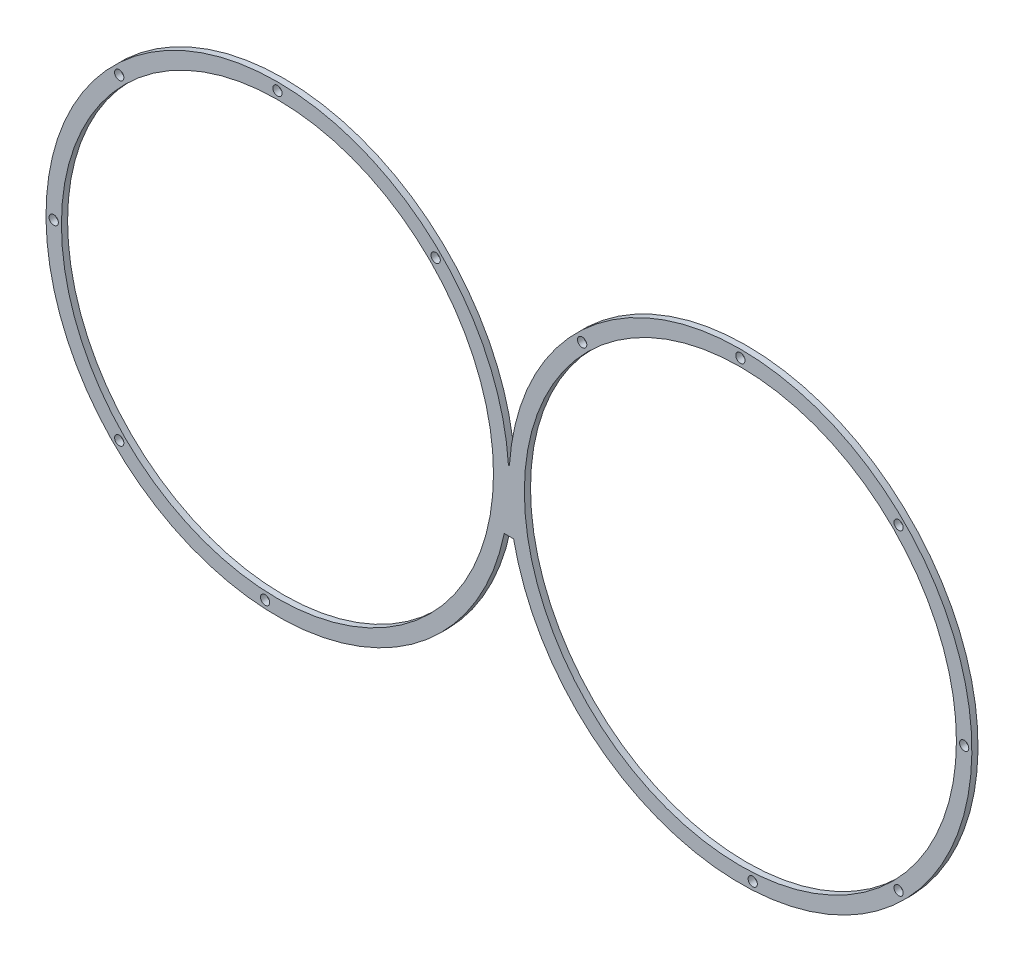
ISO-10303-21;
HEADER;
FILE_DESCRIPTION(('STEP AP214'),'2;1');
FILE_NAME('part.step','',(''),(''),'','','');
FILE_SCHEMA(('AUTOMOTIVE_DESIGN { 1 0 10303 214 1 1 1 1 }'));
ENDSEC;
DATA;
#1=APPLICATION_CONTEXT('core data for automotive mechanical design processes');
#2=APPLICATION_PROTOCOL_DEFINITION('international standard','automotive_design',2000,#1);
#3=PRODUCT_CONTEXT('',#1,'mechanical');
#4=PRODUCT('Part','Part','',(#3));
#5=PRODUCT_RELATED_PRODUCT_CATEGORY('part','',(#4));
#6=PRODUCT_DEFINITION_FORMATION('','',#4);
#7=PRODUCT_DEFINITION_CONTEXT('part definition',#1,'design');
#8=PRODUCT_DEFINITION('design','',#6,#7);
#9=PRODUCT_DEFINITION_SHAPE('','',#8);
#10=(LENGTH_UNIT() NAMED_UNIT(*) SI_UNIT(.MILLI.,.METRE.));
#11=(NAMED_UNIT(*) PLANE_ANGLE_UNIT() SI_UNIT($,.RADIAN.));
#12=(NAMED_UNIT(*) SI_UNIT($,.STERADIAN.) SOLID_ANGLE_UNIT());
#13=UNCERTAINTY_MEASURE_WITH_UNIT(LENGTH_MEASURE(1.E-05),#10,'distance_accuracy_value','');
#14=(GEOMETRIC_REPRESENTATION_CONTEXT(3) GLOBAL_UNCERTAINTY_ASSIGNED_CONTEXT((#13)) GLOBAL_UNIT_ASSIGNED_CONTEXT((#10,
#11,#12)) REPRESENTATION_CONTEXT('',''));
#15=CARTESIAN_POINT('',(0.,0.,0.));
#16=DIRECTION('',(0.,0.,1.));
#17=DIRECTION('',(1.,0.,0.));
#18=AXIS2_PLACEMENT_3D('',#15,#16,#17);
#19=CARTESIAN_POINT('',(0.,10.1713518167665,2.));
#20=DIRECTION('',(0.,1.,0.));
#21=DIRECTION('',(-1.,0.,0.));
#22=AXIS2_PLACEMENT_3D('',#19,#20,#21);
#23=PLANE('',#22);
#24=DIRECTION('',(1.,0.,0.));
#25=VECTOR('',#24,1.);
#26=CARTESIAN_POINT('',(0.,10.1713518167665,0.));
#27=LINE('',#26,#25);
#28=CARTESIAN_POINT('',(-53.2653077165046,10.1713518167664,0.));
#29=VERTEX_POINT('',#28);
#30=CARTESIAN_POINT('',(-50.2346922834954,10.1713518167664,0.));
#31=VERTEX_POINT('',#30);
#32=EDGE_CURVE('E172',#29,#31,#27,.T.);
#33=ORIENTED_EDGE('',*,*,#32,.T.);
#34=DIRECTION('',(0.,0.,-1.));
#35=VECTOR('',#34,1.);
#36=CARTESIAN_POINT('',(-50.2346922834954,10.1713518167664,2.));
#37=LINE('',#36,#35);
#38=CARTESIAN_POINT('',(-50.2346922834954,10.1713518167664,2.));
#39=VERTEX_POINT('',#38);
#40=EDGE_CURVE('E11',#39,#31,#37,.T.);
#41=ORIENTED_EDGE('',*,*,#40,.F.);
#42=DIRECTION('',(1.,0.,0.));
#43=VECTOR('',#42,1.);
#44=CARTESIAN_POINT('',(0.,10.1713518167665,2.));
#45=LINE('',#44,#43);
#46=CARTESIAN_POINT('',(-53.2653077165046,10.1713518167664,2.));
#47=VERTEX_POINT('',#46);
#48=EDGE_CURVE('E100',#47,#39,#45,.T.);
#49=ORIENTED_EDGE('',*,*,#48,.F.);
#50=DIRECTION('',(0.,0.,-1.));
#51=VECTOR('',#50,1.);
#52=CARTESIAN_POINT('',(-53.2653077165046,10.1713518167664,2.));
#53=LINE('',#52,#51);
#54=EDGE_CURVE('E112',#47,#29,#53,.T.);
#55=ORIENTED_EDGE('',*,*,#54,.T.);
#56=EDGE_LOOP('',(#33,#41,#49,#55));
#57=FACE_BOUND('',#56,.T.);
#58=ADVANCED_FACE('F47',(#57),#23,.F.);
#59=CARTESIAN_POINT('',(23.25,25.1713518167665,2.));
#60=DIRECTION('',(0.,0.,-1.));
#61=DIRECTION('',(-1.,0.,0.));
#62=AXIS2_PLACEMENT_3D('',#59,#60,#61);
#63=CYLINDRICAL_SURFACE('',#62,75.);
#64=CARTESIAN_POINT('',(23.25,25.1713518167665,0.));
#65=DIRECTION('',(0.,0.,1.));
#66=DIRECTION('',(1.,0.,0.));
#67=AXIS2_PLACEMENT_3D('',#64,#65,#66);
#68=CIRCLE('',#67,75.);
#69=CARTESIAN_POINT('',(-51.5943996349931,30.0000000000001,0.));
#70=VERTEX_POINT('',#69);
#71=EDGE_CURVE('E105',#31,#70,#68,.T.);
#72=ORIENTED_EDGE('',*,*,#71,.T.);
#73=DIRECTION('',(0.,0.,-1.));
#74=VECTOR('',#73,1.);
#75=CARTESIAN_POINT('',(-51.5943996349931,30.0000000000001,2.));
#76=LINE('',#75,#74);
#77=CARTESIAN_POINT('',(-51.5943996349931,30.0000000000001,2.));
#78=VERTEX_POINT('',#77);
#79=EDGE_CURVE('E57',#78,#70,#76,.T.);
#80=ORIENTED_EDGE('',*,*,#79,.F.);
#81=CARTESIAN_POINT('',(23.25,25.1713518167665,2.));
#82=DIRECTION('',(0.,0.,1.));
#83=DIRECTION('',(1.,0.,0.));
#84=AXIS2_PLACEMENT_3D('',#81,#82,#83);
#85=CIRCLE('',#84,75.);
#86=EDGE_CURVE('E95',#39,#78,#85,.T.);
#87=ORIENTED_EDGE('',*,*,#86,.F.);
#88=ORIENTED_EDGE('',*,*,#40,.T.);
#89=EDGE_LOOP('',(#72,#80,#87,#88));
#90=FACE_BOUND('',#89,.T.);
#91=ADVANCED_FACE('F104',(#90),#63,.T.);
#92=CARTESIAN_POINT('',(-7.69252179049663E-12,30.0000000000133,2.));
#93=DIRECTION('',(2.5641739301644E-13,-1.,0.));
#94=DIRECTION('',(1.,2.5641739301644E-13,0.));
#95=AXIS2_PLACEMENT_3D('',#92,#93,#94);
#96=PLANE('',#95);
#97=DIRECTION('',(-1.,-2.5641739301644E-13,0.));
#98=VECTOR('',#97,1.);
#99=CARTESIAN_POINT('',(-7.69252179049663E-12,30.0000000000133,0.));
#100=LINE('',#99,#98);
#101=CARTESIAN_POINT('',(-51.9056003650069,30.,0.));
#102=VERTEX_POINT('',#101);
#103=EDGE_CURVE('E82',#70,#102,#100,.T.);
#104=ORIENTED_EDGE('',*,*,#103,.T.);
#105=DIRECTION('',(0.,0.,-1.));
#106=VECTOR('',#105,1.);
#107=CARTESIAN_POINT('',(-51.9056003650069,30.,2.));
#108=LINE('',#107,#106);
#109=CARTESIAN_POINT('',(-51.9056003650069,30.,2.));
#110=VERTEX_POINT('',#109);
#111=EDGE_CURVE('E107',#110,#102,#108,.T.);
#112=ORIENTED_EDGE('',*,*,#111,.F.);
#113=DIRECTION('',(-1.,-2.5641739301644E-13,0.));
#114=VECTOR('',#113,1.);
#115=CARTESIAN_POINT('',(-7.69252179049663E-12,30.0000000000133,2.));
#116=LINE('',#115,#114);
#117=EDGE_CURVE('E98',#78,#110,#116,.T.);
#118=ORIENTED_EDGE('',*,*,#117,.F.);
#119=ORIENTED_EDGE('',*,*,#79,.T.);
#120=EDGE_LOOP('',(#104,#112,#118,#119));
#121=FACE_BOUND('',#120,.T.);
#122=ADVANCED_FACE('F108',(#121),#96,.F.);
#123=CARTESIAN_POINT('',(23.25,25.1713518167665,2.));
#124=DIRECTION('',(0.,0.,-1.));
#125=DIRECTION('',(-1.,0.,0.));
#126=AXIS2_PLACEMENT_3D('',#123,#124,#125);
#127=CYLINDRICAL_SURFACE('',#126,70.);
#128=CARTESIAN_POINT('',(23.25,25.1713518167665,2.));
#129=DIRECTION('',(0.,0.,1.));
#130=DIRECTION('',(1.,0.,0.));
#131=AXIS2_PLACEMENT_3D('',#128,#129,#130);
#132=CIRCLE('',#131,70.);
#133=CARTESIAN_POINT('',(93.25,25.1713518167665,2.));
#134=VERTEX_POINT('',#133);
#135=EDGE_CURVE('E192',#134,#134,#132,.T.);
#136=ORIENTED_EDGE('',*,*,#135,.T.);
#137=EDGE_LOOP('',(#136));
#138=FACE_BOUND('',#137,.T.);
#139=CARTESIAN_POINT('',(23.25,25.1713518167665,0.));
#140=DIRECTION('',(0.,0.,1.));
#141=DIRECTION('',(1.,0.,0.));
#142=AXIS2_PLACEMENT_3D('',#139,#140,#141);
#143=CIRCLE('',#142,70.);
#144=CARTESIAN_POINT('',(93.25,25.1713518167665,0.));
#145=VERTEX_POINT('',#144);
#146=EDGE_CURVE('E168',#145,#145,#143,.T.);
#147=ORIENTED_EDGE('',*,*,#146,.F.);
#148=EDGE_LOOP('',(#147));
#149=FACE_BOUND('',#148,.T.);
#150=ADVANCED_FACE('F280',(#138,#149),#127,.F.);
#151=CARTESIAN_POINT('',(-126.75,25.1713518167665,2.));
#152=DIRECTION('',(0.,0.,-1.));
#153=DIRECTION('',(-1.,0.,0.));
#154=AXIS2_PLACEMENT_3D('',#151,#152,#153);
#155=CYLINDRICAL_SURFACE('',#154,70.);
#156=CARTESIAN_POINT('',(-126.75,25.1713518167665,2.));
#157=DIRECTION('',(0.,0.,1.));
#158=DIRECTION('',(1.,0.,0.));
#159=AXIS2_PLACEMENT_3D('',#156,#157,#158);
#160=CIRCLE('',#159,70.);
#161=CARTESIAN_POINT('',(-56.75,25.1713518167665,2.));
#162=VERTEX_POINT('',#161);
#163=EDGE_CURVE('E195',#162,#162,#160,.T.);
#164=ORIENTED_EDGE('',*,*,#163,.T.);
#165=EDGE_LOOP('',(#164));
#166=FACE_BOUND('',#165,.T.);
#167=CARTESIAN_POINT('',(-126.75,25.1713518167665,0.));
#168=DIRECTION('',(0.,0.,1.));
#169=DIRECTION('',(1.,0.,0.));
#170=AXIS2_PLACEMENT_3D('',#167,#168,#169);
#171=CIRCLE('',#170,70.);
#172=CARTESIAN_POINT('',(-56.75,25.1713518167665,0.));
#173=VERTEX_POINT('',#172);
#174=EDGE_CURVE('E164',#173,#173,#171,.T.);
#175=ORIENTED_EDGE('',*,*,#174,.F.);
#176=EDGE_LOOP('',(#175));
#177=FACE_BOUND('',#176,.T.);
#178=ADVANCED_FACE('F283',(#166,#177),#155,.F.);
#179=CARTESIAN_POINT('',(27.25,-47.2182192553155,2.));
#180=DIRECTION('',(0.,0.,-1.));
#181=DIRECTION('',(-1.,0.,0.));
#182=AXIS2_PLACEMENT_3D('',#179,#180,#181);
#183=CYLINDRICAL_SURFACE('',#182,1.5);
#184=CARTESIAN_POINT('',(27.25,-47.2182192553155,2.));
#185=DIRECTION('',(0.,0.,1.));
#186=DIRECTION('',(1.,0.,0.));
#187=AXIS2_PLACEMENT_3D('',#184,#185,#186);
#188=CIRCLE('',#187,1.5);
#189=CARTESIAN_POINT('',(28.75,-47.2182192553155,2.));
#190=VERTEX_POINT('',#189);
#191=EDGE_CURVE('E201',#190,#190,#188,.T.);
#192=ORIENTED_EDGE('',*,*,#191,.T.);
#193=EDGE_LOOP('',(#192));
#194=FACE_BOUND('',#193,.T.);
#195=CARTESIAN_POINT('',(27.25,-47.2182192553155,0.));
#196=DIRECTION('',(0.,0.,1.));
#197=DIRECTION('',(1.,0.,0.));
#198=AXIS2_PLACEMENT_3D('',#195,#196,#197);
#199=CIRCLE('',#198,1.5);
#200=CARTESIAN_POINT('',(28.75,-47.2182192553155,0.));
#201=VERTEX_POINT('',#200);
#202=EDGE_CURVE('E160',#201,#201,#199,.T.);
#203=ORIENTED_EDGE('',*,*,#202,.F.);
#204=EDGE_LOOP('',(#203));
#205=FACE_BOUND('',#204,.T.);
#206=ADVANCED_FACE('F304',(#194,#205),#183,.F.);
#207=CARTESIAN_POINT('',(74.5152416360244,-26.0938898192585,2.));
#208=DIRECTION('',(0.,0.,-1.));
#209=DIRECTION('',(-1.,0.,0.));
#210=AXIS2_PLACEMENT_3D('',#207,#208,#209);
#211=CYLINDRICAL_SURFACE('',#210,1.5);
#212=CARTESIAN_POINT('',(74.5152416360244,-26.0938898192585,2.));
#213=DIRECTION('',(0.,0.,1.));
#214=DIRECTION('',(1.,0.,0.));
#215=AXIS2_PLACEMENT_3D('',#212,#213,#214);
#216=CIRCLE('',#215,1.5);
#217=CARTESIAN_POINT('',(76.0152416360244,-26.0938898192585,2.));
#218=VERTEX_POINT('',#217);
#219=EDGE_CURVE('E205',#218,#218,#216,.T.);
#220=ORIENTED_EDGE('',*,*,#219,.T.);
#221=EDGE_LOOP('',(#220));
#222=FACE_BOUND('',#221,.T.);
#223=CARTESIAN_POINT('',(74.5152416360244,-26.0938898192585,0.));
#224=DIRECTION('',(0.,0.,1.));
#225=DIRECTION('',(1.,0.,0.));
#226=AXIS2_PLACEMENT_3D('',#223,#224,#225);
#227=CIRCLE('',#226,1.5);
#228=CARTESIAN_POINT('',(76.0152416360244,-26.0938898192585,0.));
#229=VERTEX_POINT('',#228);
#230=EDGE_CURVE('E156',#229,#229,#227,.T.);
#231=ORIENTED_EDGE('',*,*,#230,.F.);
#232=EDGE_LOOP('',(#231));
#233=FACE_BOUND('',#232,.T.);
#234=ADVANCED_FACE('F308',(#222,#233),#211,.F.);
#235=CARTESIAN_POINT('',(95.75,25.1713518167665,2.));
#236=DIRECTION('',(0.,0.,-1.));
#237=DIRECTION('',(-1.,0.,0.));
#238=AXIS2_PLACEMENT_3D('',#235,#236,#237);
#239=CYLINDRICAL_SURFACE('',#238,1.5);
#240=CARTESIAN_POINT('',(95.75,25.1713518167665,2.));
#241=DIRECTION('',(0.,0.,1.));
#242=DIRECTION('',(1.,0.,0.));
#243=AXIS2_PLACEMENT_3D('',#240,#241,#242);
#244=CIRCLE('',#243,1.5);
#245=CARTESIAN_POINT('',(97.25,25.1713518167665,2.));
#246=VERTEX_POINT('',#245);
#247=EDGE_CURVE('E209',#246,#246,#244,.T.);
#248=ORIENTED_EDGE('',*,*,#247,.T.);
#249=EDGE_LOOP('',(#248));
#250=FACE_BOUND('',#249,.T.);
#251=CARTESIAN_POINT('',(95.75,25.1713518167665,0.));
#252=DIRECTION('',(0.,0.,1.));
#253=DIRECTION('',(1.,0.,0.));
#254=AXIS2_PLACEMENT_3D('',#251,#252,#253);
#255=CIRCLE('',#254,1.5);
#256=CARTESIAN_POINT('',(97.25,25.1713518167665,0.));
#257=VERTEX_POINT('',#256);
#258=EDGE_CURVE('E152',#257,#257,#255,.T.);
#259=ORIENTED_EDGE('',*,*,#258,.F.);
#260=EDGE_LOOP('',(#259));
#261=FACE_BOUND('',#260,.T.);
#262=ADVANCED_FACE('F312',(#250,#261),#239,.F.);
#263=CARTESIAN_POINT('',(74.5152416360248,76.4365934527911,2.));
#264=DIRECTION('',(0.,0.,-1.));
#265=DIRECTION('',(-1.,0.,0.));
#266=AXIS2_PLACEMENT_3D('',#263,#264,#265);
#267=CYLINDRICAL_SURFACE('',#266,1.5);
#268=CARTESIAN_POINT('',(74.5152416360248,76.4365934527911,2.));
#269=DIRECTION('',(0.,0.,1.));
#270=DIRECTION('',(1.,0.,0.));
#271=AXIS2_PLACEMENT_3D('',#268,#269,#270);
#272=CIRCLE('',#271,1.5);
#273=CARTESIAN_POINT('',(76.0152416360248,76.4365934527911,2.));
#274=VERTEX_POINT('',#273);
#275=EDGE_CURVE('E213',#274,#274,#272,.T.);
#276=ORIENTED_EDGE('',*,*,#275,.T.);
#277=EDGE_LOOP('',(#276));
#278=FACE_BOUND('',#277,.T.);
#279=CARTESIAN_POINT('',(74.5152416360248,76.4365934527911,0.));
#280=DIRECTION('',(0.,0.,1.));
#281=DIRECTION('',(1.,0.,0.));
#282=AXIS2_PLACEMENT_3D('',#279,#280,#281);
#283=CIRCLE('',#282,1.5);
#284=CARTESIAN_POINT('',(76.0152416360248,76.4365934527911,0.));
#285=VERTEX_POINT('',#284);
#286=EDGE_CURVE('E148',#285,#285,#283,.T.);
#287=ORIENTED_EDGE('',*,*,#286,.F.);
#288=EDGE_LOOP('',(#287));
#289=FACE_BOUND('',#288,.T.);
#290=ADVANCED_FACE('F316',(#278,#289),#267,.F.);
#291=CARTESIAN_POINT('',(23.25,97.6713518167665,2.));
#292=DIRECTION('',(0.,0.,-1.));
#293=DIRECTION('',(-1.,0.,0.));
#294=AXIS2_PLACEMENT_3D('',#291,#292,#293);
#295=CYLINDRICAL_SURFACE('',#294,1.5);
#296=CARTESIAN_POINT('',(23.25,97.6713518167665,2.));
#297=DIRECTION('',(0.,0.,1.));
#298=DIRECTION('',(1.,0.,0.));
#299=AXIS2_PLACEMENT_3D('',#296,#297,#298);
#300=CIRCLE('',#299,1.5);
#301=CARTESIAN_POINT('',(24.75,97.6713518167665,2.));
#302=VERTEX_POINT('',#301);
#303=EDGE_CURVE('E217',#302,#302,#300,.T.);
#304=ORIENTED_EDGE('',*,*,#303,.T.);
#305=EDGE_LOOP('',(#304));
#306=FACE_BOUND('',#305,.T.);
#307=CARTESIAN_POINT('',(23.25,97.6713518167665,0.));
#308=DIRECTION('',(0.,0.,1.));
#309=DIRECTION('',(1.,0.,0.));
#310=AXIS2_PLACEMENT_3D('',#307,#308,#309);
#311=CIRCLE('',#310,1.5);
#312=CARTESIAN_POINT('',(24.75,97.6713518167665,0.));
#313=VERTEX_POINT('',#312);
#314=EDGE_CURVE('E144',#313,#313,#311,.T.);
#315=ORIENTED_EDGE('',*,*,#314,.F.);
#316=EDGE_LOOP('',(#315));
#317=FACE_BOUND('',#316,.T.);
#318=ADVANCED_FACE('F320',(#306,#317),#295,.F.);
#319=CARTESIAN_POINT('',(-28.0152416360244,76.4365934527915,2.));
#320=DIRECTION('',(0.,0.,-1.));
#321=DIRECTION('',(-1.,0.,0.));
#322=AXIS2_PLACEMENT_3D('',#319,#320,#321);
#323=CYLINDRICAL_SURFACE('',#322,1.5);
#324=CARTESIAN_POINT('',(-28.0152416360244,76.4365934527915,2.));
#325=DIRECTION('',(0.,0.,1.));
#326=DIRECTION('',(1.,0.,0.));
#327=AXIS2_PLACEMENT_3D('',#324,#325,#326);
#328=CIRCLE('',#327,1.5);
#329=CARTESIAN_POINT('',(-26.5152416360244,76.4365934527915,2.));
#330=VERTEX_POINT('',#329);
#331=EDGE_CURVE('E221',#330,#330,#328,.T.);
#332=ORIENTED_EDGE('',*,*,#331,.T.);
#333=EDGE_LOOP('',(#332));
#334=FACE_BOUND('',#333,.T.);
#335=CARTESIAN_POINT('',(-28.0152416360244,76.4365934527915,0.));
#336=DIRECTION('',(0.,0.,1.));
#337=DIRECTION('',(1.,0.,0.));
#338=AXIS2_PLACEMENT_3D('',#335,#336,#337);
#339=CIRCLE('',#338,1.5);
#340=CARTESIAN_POINT('',(-26.5152416360244,76.4365934527915,0.));
#341=VERTEX_POINT('',#340);
#342=EDGE_CURVE('E140',#341,#341,#339,.T.);
#343=ORIENTED_EDGE('',*,*,#342,.F.);
#344=EDGE_LOOP('',(#343));
#345=FACE_BOUND('',#344,.T.);
#346=ADVANCED_FACE('F324',(#334,#345),#323,.F.);
#347=CARTESIAN_POINT('',(-75.4847583639756,76.4365934527915,2.));
#348=DIRECTION('',(0.,0.,-1.));
#349=DIRECTION('',(-1.,0.,0.));
#350=AXIS2_PLACEMENT_3D('',#347,#348,#349);
#351=CYLINDRICAL_SURFACE('',#350,1.5);
#352=CARTESIAN_POINT('',(-75.4847583639756,76.4365934527915,2.));
#353=DIRECTION('',(0.,0.,1.));
#354=DIRECTION('',(1.,0.,0.));
#355=AXIS2_PLACEMENT_3D('',#352,#353,#354);
#356=CIRCLE('',#355,1.5);
#357=CARTESIAN_POINT('',(-73.9847583639756,76.4365934527915,2.));
#358=VERTEX_POINT('',#357);
#359=EDGE_CURVE('E225',#358,#358,#356,.T.);
#360=ORIENTED_EDGE('',*,*,#359,.T.);
#361=EDGE_LOOP('',(#360));
#362=FACE_BOUND('',#361,.T.);
#363=CARTESIAN_POINT('',(-75.4847583639756,76.4365934527915,0.));
#364=DIRECTION('',(0.,0.,1.));
#365=DIRECTION('',(1.,0.,0.));
#366=AXIS2_PLACEMENT_3D('',#363,#364,#365);
#367=CIRCLE('',#366,1.5);
#368=CARTESIAN_POINT('',(-73.9847583639756,76.4365934527915,0.));
#369=VERTEX_POINT('',#368);
#370=EDGE_CURVE('E136',#369,#369,#367,.T.);
#371=ORIENTED_EDGE('',*,*,#370,.F.);
#372=EDGE_LOOP('',(#371));
#373=FACE_BOUND('',#372,.T.);
#374=ADVANCED_FACE('F328',(#362,#373),#351,.F.);
#375=CARTESIAN_POINT('',(-126.75,97.6713518167665,2.));
#376=DIRECTION('',(0.,0.,-1.));
#377=DIRECTION('',(-1.,0.,0.));
#378=AXIS2_PLACEMENT_3D('',#375,#376,#377);
#379=CYLINDRICAL_SURFACE('',#378,1.5);
#380=CARTESIAN_POINT('',(-126.75,97.6713518167665,2.));
#381=DIRECTION('',(0.,0.,1.));
#382=DIRECTION('',(1.,0.,0.));
#383=AXIS2_PLACEMENT_3D('',#380,#381,#382);
#384=CIRCLE('',#383,1.5);
#385=CARTESIAN_POINT('',(-125.25,97.6713518167665,2.));
#386=VERTEX_POINT('',#385);
#387=EDGE_CURVE('E229',#386,#386,#384,.T.);
#388=ORIENTED_EDGE('',*,*,#387,.T.);
#389=EDGE_LOOP('',(#388));
#390=FACE_BOUND('',#389,.T.);
#391=CARTESIAN_POINT('',(-126.75,97.6713518167665,0.));
#392=DIRECTION('',(0.,0.,1.));
#393=DIRECTION('',(1.,0.,0.));
#394=AXIS2_PLACEMENT_3D('',#391,#392,#393);
#395=CIRCLE('',#394,1.5);
#396=CARTESIAN_POINT('',(-125.25,97.6713518167665,0.));
#397=VERTEX_POINT('',#396);
#398=EDGE_CURVE('E132',#397,#397,#395,.T.);
#399=ORIENTED_EDGE('',*,*,#398,.F.);
#400=EDGE_LOOP('',(#399));
#401=FACE_BOUND('',#400,.T.);
#402=ADVANCED_FACE('F332',(#390,#401),#379,.F.);
#403=CARTESIAN_POINT('',(-178.015241636025,76.4365934527911,2.));
#404=DIRECTION('',(0.,0.,-1.));
#405=DIRECTION('',(-1.,0.,0.));
#406=AXIS2_PLACEMENT_3D('',#403,#404,#405);
#407=CYLINDRICAL_SURFACE('',#406,1.5);
#408=CARTESIAN_POINT('',(-178.015241636025,76.4365934527911,2.));
#409=DIRECTION('',(0.,0.,1.));
#410=DIRECTION('',(1.,0.,0.));
#411=AXIS2_PLACEMENT_3D('',#408,#409,#410);
#412=CIRCLE('',#411,1.5);
#413=CARTESIAN_POINT('',(-176.515241636025,76.4365934527911,2.));
#414=VERTEX_POINT('',#413);
#415=EDGE_CURVE('E233',#414,#414,#412,.T.);
#416=ORIENTED_EDGE('',*,*,#415,.T.);
#417=EDGE_LOOP('',(#416));
#418=FACE_BOUND('',#417,.T.);
#419=CARTESIAN_POINT('',(-178.015241636025,76.4365934527911,0.));
#420=DIRECTION('',(0.,0.,1.));
#421=DIRECTION('',(1.,0.,0.));
#422=AXIS2_PLACEMENT_3D('',#419,#420,#421);
#423=CIRCLE('',#422,1.5);
#424=CARTESIAN_POINT('',(-176.515241636025,76.4365934527911,0.));
#425=VERTEX_POINT('',#424);
#426=EDGE_CURVE('E128',#425,#425,#423,.T.);
#427=ORIENTED_EDGE('',*,*,#426,.F.);
#428=EDGE_LOOP('',(#427));
#429=FACE_BOUND('',#428,.T.);
#430=ADVANCED_FACE('F336',(#418,#429),#407,.F.);
#431=CARTESIAN_POINT('',(-130.75,-47.2182192553155,2.));
#432=DIRECTION('',(0.,0.,-1.));
#433=DIRECTION('',(-1.,0.,0.));
#434=AXIS2_PLACEMENT_3D('',#431,#432,#433);
#435=CYLINDRICAL_SURFACE('',#434,1.5);
#436=CARTESIAN_POINT('',(-130.75,-47.2182192553155,2.));
#437=DIRECTION('',(0.,0.,1.));
#438=DIRECTION('',(1.,0.,0.));
#439=AXIS2_PLACEMENT_3D('',#436,#437,#438);
#440=CIRCLE('',#439,1.5);
#441=CARTESIAN_POINT('',(-129.25,-47.2182192553155,2.));
#442=VERTEX_POINT('',#441);
#443=EDGE_CURVE('E237',#442,#442,#440,.T.);
#444=ORIENTED_EDGE('',*,*,#443,.T.);
#445=EDGE_LOOP('',(#444));
#446=FACE_BOUND('',#445,.T.);
#447=CARTESIAN_POINT('',(-130.75,-47.2182192553155,0.));
#448=DIRECTION('',(0.,0.,1.));
#449=DIRECTION('',(1.,0.,0.));
#450=AXIS2_PLACEMENT_3D('',#447,#448,#449);
#451=CIRCLE('',#450,1.5);
#452=CARTESIAN_POINT('',(-129.25,-47.2182192553155,0.));
#453=VERTEX_POINT('',#452);
#454=EDGE_CURVE('E124',#453,#453,#451,.T.);
#455=ORIENTED_EDGE('',*,*,#454,.F.);
#456=EDGE_LOOP('',(#455));
#457=FACE_BOUND('',#456,.T.);
#458=ADVANCED_FACE('F340',(#446,#457),#435,.F.);
#459=CARTESIAN_POINT('',(-178.015241636024,-26.0938898192585,2.));
#460=DIRECTION('',(0.,0.,-1.));
#461=DIRECTION('',(-1.,0.,0.));
#462=AXIS2_PLACEMENT_3D('',#459,#460,#461);
#463=CYLINDRICAL_SURFACE('',#462,1.5);
#464=CARTESIAN_POINT('',(-178.015241636024,-26.0938898192585,2.));
#465=DIRECTION('',(0.,0.,1.));
#466=DIRECTION('',(1.,0.,0.));
#467=AXIS2_PLACEMENT_3D('',#464,#465,#466);
#468=CIRCLE('',#467,1.5);
#469=CARTESIAN_POINT('',(-176.515241636024,-26.0938898192585,2.));
#470=VERTEX_POINT('',#469);
#471=EDGE_CURVE('E241',#470,#470,#468,.T.);
#472=ORIENTED_EDGE('',*,*,#471,.T.);
#473=EDGE_LOOP('',(#472));
#474=FACE_BOUND('',#473,.T.);
#475=CARTESIAN_POINT('',(-178.015241636024,-26.0938898192585,0.));
#476=DIRECTION('',(0.,0.,1.));
#477=DIRECTION('',(1.,0.,0.));
#478=AXIS2_PLACEMENT_3D('',#475,#476,#477);
#479=CIRCLE('',#478,1.5);
#480=CARTESIAN_POINT('',(-176.515241636024,-26.0938898192585,0.));
#481=VERTEX_POINT('',#480);
#482=EDGE_CURVE('E120',#481,#481,#479,.T.);
#483=ORIENTED_EDGE('',*,*,#482,.F.);
#484=EDGE_LOOP('',(#483));
#485=FACE_BOUND('',#484,.T.);
#486=ADVANCED_FACE('F343',(#474,#485),#463,.F.);
#487=CARTESIAN_POINT('',(-199.25,25.1713518167665,2.));
#488=DIRECTION('',(0.,0.,-1.));
#489=DIRECTION('',(-1.,0.,0.));
#490=AXIS2_PLACEMENT_3D('',#487,#488,#489);
#491=CYLINDRICAL_SURFACE('',#490,1.5);
#492=CARTESIAN_POINT('',(-199.25,25.1713518167665,2.));
#493=DIRECTION('',(0.,0.,1.));
#494=DIRECTION('',(1.,0.,0.));
#495=AXIS2_PLACEMENT_3D('',#492,#493,#494);
#496=CIRCLE('',#495,1.5);
#497=CARTESIAN_POINT('',(-197.75,25.1713518167665,2.));
#498=VERTEX_POINT('',#497);
#499=EDGE_CURVE('E182',#498,#498,#496,.T.);
#500=ORIENTED_EDGE('',*,*,#499,.T.);
#501=EDGE_LOOP('',(#500));
#502=FACE_BOUND('',#501,.T.);
#503=CARTESIAN_POINT('',(-199.25,25.1713518167665,0.));
#504=DIRECTION('',(0.,0.,1.));
#505=DIRECTION('',(1.,0.,0.));
#506=AXIS2_PLACEMENT_3D('',#503,#504,#505);
#507=CIRCLE('',#506,1.5);
#508=CARTESIAN_POINT('',(-197.75,25.1713518167665,0.));
#509=VERTEX_POINT('',#508);
#510=EDGE_CURVE('E116',#509,#509,#507,.T.);
#511=ORIENTED_EDGE('',*,*,#510,.F.);
#512=EDGE_LOOP('',(#511));
#513=FACE_BOUND('',#512,.T.);
#514=ADVANCED_FACE('F49',(#502,#513),#491,.F.);
#515=CARTESIAN_POINT('',(-126.75,25.1713518167665,2.));
#516=DIRECTION('',(0.,0.,-1.));
#517=DIRECTION('',(-1.,0.,0.));
#518=AXIS2_PLACEMENT_3D('',#515,#516,#517);
#519=CYLINDRICAL_SURFACE('',#518,75.);
#520=CARTESIAN_POINT('',(-126.75,25.1713518167665,0.));
#521=DIRECTION('',(0.,0.,1.));
#522=DIRECTION('',(1.,0.,0.));
#523=AXIS2_PLACEMENT_3D('',#520,#521,#522);
#524=CIRCLE('',#523,75.);
#525=EDGE_CURVE('E88',#102,#29,#524,.T.);
#526=ORIENTED_EDGE('',*,*,#525,.T.);
#527=ORIENTED_EDGE('',*,*,#54,.F.);
#528=CARTESIAN_POINT('',(-126.75,25.1713518167665,2.));
#529=DIRECTION('',(0.,0.,1.));
#530=DIRECTION('',(1.,0.,0.));
#531=AXIS2_PLACEMENT_3D('',#528,#529,#530);
#532=CIRCLE('',#531,75.);
#533=EDGE_CURVE('E65',#110,#47,#532,.T.);
#534=ORIENTED_EDGE('',*,*,#533,.F.);
#535=ORIENTED_EDGE('',*,*,#111,.T.);
#536=EDGE_LOOP('',(#526,#527,#534,#535));
#537=FACE_BOUND('',#536,.T.);
#538=ADVANCED_FACE('F186',(#537),#519,.T.);
#539=CARTESIAN_POINT('',(0.,0.,2.));
#540=DIRECTION('',(0.,0.,1.));
#541=DIRECTION('',(1.,0.,0.));
#542=AXIS2_PLACEMENT_3D('',#539,#540,#541);
#543=PLANE('',#542);
#544=ORIENTED_EDGE('',*,*,#499,.F.);
#545=EDGE_LOOP('',(#544));
#546=FACE_BOUND('',#545,.T.);
#547=ORIENTED_EDGE('',*,*,#471,.F.);
#548=EDGE_LOOP('',(#547));
#549=FACE_BOUND('',#548,.T.);
#550=ORIENTED_EDGE('',*,*,#443,.F.);
#551=EDGE_LOOP('',(#550));
#552=FACE_BOUND('',#551,.T.);
#553=ORIENTED_EDGE('',*,*,#415,.F.);
#554=EDGE_LOOP('',(#553));
#555=FACE_BOUND('',#554,.T.);
#556=ORIENTED_EDGE('',*,*,#387,.F.);
#557=EDGE_LOOP('',(#556));
#558=FACE_BOUND('',#557,.T.);
#559=ORIENTED_EDGE('',*,*,#359,.F.);
#560=EDGE_LOOP('',(#559));
#561=FACE_BOUND('',#560,.T.);
#562=ORIENTED_EDGE('',*,*,#331,.F.);
#563=EDGE_LOOP('',(#562));
#564=FACE_BOUND('',#563,.T.);
#565=ORIENTED_EDGE('',*,*,#303,.F.);
#566=EDGE_LOOP('',(#565));
#567=FACE_BOUND('',#566,.T.);
#568=ORIENTED_EDGE('',*,*,#275,.F.);
#569=EDGE_LOOP('',(#568));
#570=FACE_BOUND('',#569,.T.);
#571=ORIENTED_EDGE('',*,*,#247,.F.);
#572=EDGE_LOOP('',(#571));
#573=FACE_BOUND('',#572,.T.);
#574=ORIENTED_EDGE('',*,*,#219,.F.);
#575=EDGE_LOOP('',(#574));
#576=FACE_BOUND('',#575,.T.);
#577=ORIENTED_EDGE('',*,*,#191,.F.);
#578=EDGE_LOOP('',(#577));
#579=FACE_BOUND('',#578,.T.);
#580=ORIENTED_EDGE('',*,*,#163,.F.);
#581=EDGE_LOOP('',(#580));
#582=FACE_BOUND('',#581,.T.);
#583=ORIENTED_EDGE('',*,*,#135,.F.);
#584=EDGE_LOOP('',(#583));
#585=FACE_BOUND('',#584,.T.);
#586=ORIENTED_EDGE('',*,*,#48,.T.);
#587=ORIENTED_EDGE('',*,*,#86,.T.);
#588=ORIENTED_EDGE('',*,*,#117,.T.);
#589=ORIENTED_EDGE('',*,*,#533,.T.);
#590=EDGE_LOOP('',(#586,#587,#588,#589));
#591=FACE_BOUND('',#590,.T.);
#592=ADVANCED_FACE('F96',(#546,#549,#552,#555,#558,#561,#564,#567,#570,#573,#576,#579,#582,#585,
#591),#543,.T.);
#593=CARTESIAN_POINT('',(0.,0.,0.));
#594=DIRECTION('',(0.,0.,1.));
#595=DIRECTION('',(1.,0.,0.));
#596=AXIS2_PLACEMENT_3D('',#593,#594,#595);
#597=PLANE('',#596);
#598=ORIENTED_EDGE('',*,*,#510,.T.);
#599=EDGE_LOOP('',(#598));
#600=FACE_BOUND('',#599,.T.);
#601=ORIENTED_EDGE('',*,*,#482,.T.);
#602=EDGE_LOOP('',(#601));
#603=FACE_BOUND('',#602,.T.);
#604=ORIENTED_EDGE('',*,*,#454,.T.);
#605=EDGE_LOOP('',(#604));
#606=FACE_BOUND('',#605,.T.);
#607=ORIENTED_EDGE('',*,*,#426,.T.);
#608=EDGE_LOOP('',(#607));
#609=FACE_BOUND('',#608,.T.);
#610=ORIENTED_EDGE('',*,*,#398,.T.);
#611=EDGE_LOOP('',(#610));
#612=FACE_BOUND('',#611,.T.);
#613=ORIENTED_EDGE('',*,*,#370,.T.);
#614=EDGE_LOOP('',(#613));
#615=FACE_BOUND('',#614,.T.);
#616=ORIENTED_EDGE('',*,*,#342,.T.);
#617=EDGE_LOOP('',(#616));
#618=FACE_BOUND('',#617,.T.);
#619=ORIENTED_EDGE('',*,*,#314,.T.);
#620=EDGE_LOOP('',(#619));
#621=FACE_BOUND('',#620,.T.);
#622=ORIENTED_EDGE('',*,*,#286,.T.);
#623=EDGE_LOOP('',(#622));
#624=FACE_BOUND('',#623,.T.);
#625=ORIENTED_EDGE('',*,*,#258,.T.);
#626=EDGE_LOOP('',(#625));
#627=FACE_BOUND('',#626,.T.);
#628=ORIENTED_EDGE('',*,*,#230,.T.);
#629=EDGE_LOOP('',(#628));
#630=FACE_BOUND('',#629,.T.);
#631=ORIENTED_EDGE('',*,*,#202,.T.);
#632=EDGE_LOOP('',(#631));
#633=FACE_BOUND('',#632,.T.);
#634=ORIENTED_EDGE('',*,*,#174,.T.);
#635=EDGE_LOOP('',(#634));
#636=FACE_BOUND('',#635,.T.);
#637=ORIENTED_EDGE('',*,*,#146,.T.);
#638=EDGE_LOOP('',(#637));
#639=FACE_BOUND('',#638,.T.);
#640=ORIENTED_EDGE('',*,*,#32,.F.);
#641=ORIENTED_EDGE('',*,*,#525,.F.);
#642=ORIENTED_EDGE('',*,*,#103,.F.);
#643=ORIENTED_EDGE('',*,*,#71,.F.);
#644=EDGE_LOOP('',(#640,#641,#642,#643));
#645=FACE_BOUND('',#644,.T.);
#646=ADVANCED_FACE('F189',(#600,#603,#606,#609,#612,#615,#618,#621,#624,#627,#630,#633,#636,
#639,#645),#597,.F.);
#647=CLOSED_SHELL('',(#58,#91,#122,#150,#178,#206,#234,#262,#290,#318,#346,#374,#402,#430,#458,
#486,#514,#538,#592,#646));
#648=MANIFOLD_SOLID_BREP('B2',#647);
#649=ADVANCED_BREP_SHAPE_REPRESENTATION('',(#18,#648),#14);
#650=SHAPE_DEFINITION_REPRESENTATION(#9,#649);
ENDSEC;
END-ISO-10303-21;
